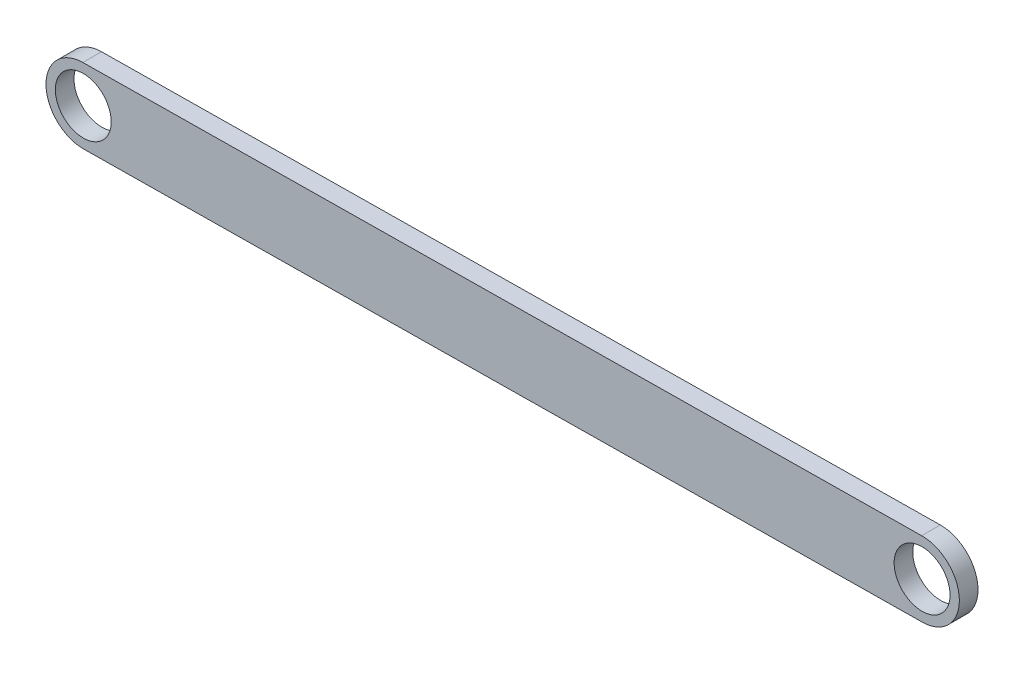
ISO-10303-21;
HEADER;
FILE_DESCRIPTION(('STEP AP214'),'2;1');
FILE_NAME('part.step','',(''),(''),'','','');
FILE_SCHEMA(('AUTOMOTIVE_DESIGN { 1 0 10303 214 1 1 1 1 }'));
ENDSEC;
DATA;
#1=APPLICATION_CONTEXT('core data for automotive mechanical design processes');
#2=APPLICATION_PROTOCOL_DEFINITION('international standard','automotive_design',2000,#1);
#3=PRODUCT_CONTEXT('',#1,'mechanical');
#4=PRODUCT('Part','Part','',(#3));
#5=PRODUCT_RELATED_PRODUCT_CATEGORY('part','',(#4));
#6=PRODUCT_DEFINITION_FORMATION('','',#4);
#7=PRODUCT_DEFINITION_CONTEXT('part definition',#1,'design');
#8=PRODUCT_DEFINITION('design','',#6,#7);
#9=PRODUCT_DEFINITION_SHAPE('','',#8);
#10=(LENGTH_UNIT() NAMED_UNIT(*) SI_UNIT(.MILLI.,.METRE.));
#11=(NAMED_UNIT(*) PLANE_ANGLE_UNIT() SI_UNIT($,.RADIAN.));
#12=(NAMED_UNIT(*) SI_UNIT($,.STERADIAN.) SOLID_ANGLE_UNIT());
#13=UNCERTAINTY_MEASURE_WITH_UNIT(LENGTH_MEASURE(1.E-05),#10,'distance_accuracy_value','');
#14=(GEOMETRIC_REPRESENTATION_CONTEXT(3) GLOBAL_UNCERTAINTY_ASSIGNED_CONTEXT((#13)) GLOBAL_UNIT_ASSIGNED_CONTEXT((#10,
#11,#12)) REPRESENTATION_CONTEXT('',''));
#15=CARTESIAN_POINT('',(0.,0.,0.));
#16=DIRECTION('',(0.,0.,1.));
#17=DIRECTION('',(1.,0.,0.));
#18=AXIS2_PLACEMENT_3D('',#15,#16,#17);
#19=CARTESIAN_POINT('',(0.,0.,10.));
#20=DIRECTION('',(0.,0.,1.));
#21=DIRECTION('',(1.,0.,0.));
#22=AXIS2_PLACEMENT_3D('',#19,#20,#21);
#23=PLANE('',#22);
#24=CARTESIAN_POINT('',(0.,0.,10.));
#25=DIRECTION('',(0.,0.,1.));
#26=DIRECTION('',(1.,0.,0.));
#27=AXIS2_PLACEMENT_3D('',#24,#25,#26);
#28=CIRCLE('',#27,15.);
#29=CARTESIAN_POINT('',(15.,0.,10.));
#30=VERTEX_POINT('',#29);
#31=EDGE_CURVE('E116',#30,#30,#28,.T.);
#32=ORIENTED_EDGE('',*,*,#31,.F.);
#33=EDGE_LOOP('',(#32));
#34=FACE_BOUND('',#33,.T.);
#35=CARTESIAN_POINT('',(0.,0.,10.));
#36=DIRECTION('',(0.,0.,1.));
#37=DIRECTION('',(1.,0.,0.));
#38=AXIS2_PLACEMENT_3D('',#35,#36,#37);
#39=CIRCLE('',#38,20.0013052022372);
#40=CARTESIAN_POINT('',(-0.228494623655914,20.,10.));
#41=VERTEX_POINT('',#40);
#42=CARTESIAN_POINT('',(0.228494623655914,-20.,10.));
#43=VERTEX_POINT('',#42);
#44=EDGE_CURVE('E96',#41,#43,#39,.T.);
#45=ORIENTED_EDGE('',*,*,#44,.T.);
#46=DIRECTION('',(0.999934744146746,0.0114239856522142,0.));
#47=VECTOR('',#46,1.);
#48=CARTESIAN_POINT('',(0.228494623655914,-20.,10.));
#49=LINE('',#48,#47);
#50=CARTESIAN_POINT('',(450.228494623656,-14.858870967742,10.));
#51=VERTEX_POINT('',#50);
#52=EDGE_CURVE('E91',#43,#51,#49,.T.);
#53=ORIENTED_EDGE('',*,*,#52,.T.);
#54=CARTESIAN_POINT('',(450.,5.14112903225806,10.));
#55=DIRECTION('',(0.,0.,1.));
#56=DIRECTION('',(1.,0.,0.));
#57=AXIS2_PLACEMENT_3D('',#54,#55,#56);
#58=CIRCLE('',#57,20.0013052022372);
#59=CARTESIAN_POINT('',(449.771505376344,25.1411290322581,10.));
#60=VERTEX_POINT('',#59);
#61=EDGE_CURVE('E94',#51,#60,#58,.T.);
#62=ORIENTED_EDGE('',*,*,#61,.T.);
#63=DIRECTION('',(-0.999934744146746,-0.0114239856522142,0.));
#64=VECTOR('',#63,1.);
#65=CARTESIAN_POINT('',(-0.228494623655914,20.,10.));
#66=LINE('',#65,#64);
#67=EDGE_CURVE('E61',#60,#41,#66,.T.);
#68=ORIENTED_EDGE('',*,*,#67,.T.);
#69=EDGE_LOOP('',(#45,#53,#62,#68));
#70=FACE_BOUND('',#69,.T.);
#71=CARTESIAN_POINT('',(450.,5.14112903225806,10.));
#72=DIRECTION('',(0.,0.,1.));
#73=DIRECTION('',(1.,0.,0.));
#74=AXIS2_PLACEMENT_3D('',#71,#72,#73);
#75=CIRCLE('',#74,15.);
#76=CARTESIAN_POINT('',(465.,5.14112903225806,10.));
#77=VERTEX_POINT('',#76);
#78=EDGE_CURVE('E138',#77,#77,#75,.T.);
#79=ORIENTED_EDGE('',*,*,#78,.F.);
#80=EDGE_LOOP('',(#79));
#81=FACE_BOUND('',#80,.T.);
#82=ADVANCED_FACE('F43',(#34,#70,#81),#23,.T.);
#83=CARTESIAN_POINT('',(0.,0.,0.));
#84=DIRECTION('',(0.,0.,1.));
#85=DIRECTION('',(1.,0.,0.));
#86=AXIS2_PLACEMENT_3D('',#83,#84,#85);
#87=PLANE('',#86);
#88=CARTESIAN_POINT('',(0.,0.,0.));
#89=DIRECTION('',(0.,0.,1.));
#90=DIRECTION('',(1.,0.,0.));
#91=AXIS2_PLACEMENT_3D('',#88,#89,#90);
#92=CIRCLE('',#91,20.0013052022372);
#93=CARTESIAN_POINT('',(-0.228494623655914,20.,0.));
#94=VERTEX_POINT('',#93);
#95=CARTESIAN_POINT('',(0.228494623655914,-20.,0.));
#96=VERTEX_POINT('',#95);
#97=EDGE_CURVE('E112',#94,#96,#92,.T.);
#98=ORIENTED_EDGE('',*,*,#97,.F.);
#99=DIRECTION('',(-0.999934744146746,-0.0114239856522142,0.));
#100=VECTOR('',#99,1.);
#101=CARTESIAN_POINT('',(-0.228494623655914,20.,0.));
#102=LINE('',#101,#100);
#103=CARTESIAN_POINT('',(449.771505376344,25.1411290322581,0.));
#104=VERTEX_POINT('',#103);
#105=EDGE_CURVE('E84',#104,#94,#102,.T.);
#106=ORIENTED_EDGE('',*,*,#105,.F.);
#107=CARTESIAN_POINT('',(450.,5.14112903225806,0.));
#108=DIRECTION('',(0.,0.,1.));
#109=DIRECTION('',(1.,0.,0.));
#110=AXIS2_PLACEMENT_3D('',#107,#108,#109);
#111=CIRCLE('',#110,20.0013052022372);
#112=CARTESIAN_POINT('',(450.228494623656,-14.858870967742,0.));
#113=VERTEX_POINT('',#112);
#114=EDGE_CURVE('E78',#113,#104,#111,.T.);
#115=ORIENTED_EDGE('',*,*,#114,.F.);
#116=DIRECTION('',(0.999934744146746,0.0114239856522142,0.));
#117=VECTOR('',#116,1.);
#118=CARTESIAN_POINT('',(0.228494623655914,-20.,0.));
#119=LINE('',#118,#117);
#120=EDGE_CURVE('E101',#96,#113,#119,.T.);
#121=ORIENTED_EDGE('',*,*,#120,.F.);
#122=EDGE_LOOP('',(#98,#106,#115,#121));
#123=FACE_BOUND('',#122,.T.);
#124=CARTESIAN_POINT('',(0.,0.,0.));
#125=DIRECTION('',(0.,0.,1.));
#126=DIRECTION('',(1.,0.,0.));
#127=AXIS2_PLACEMENT_3D('',#124,#125,#126);
#128=CIRCLE('',#127,15.);
#129=CARTESIAN_POINT('',(15.,0.,0.));
#130=VERTEX_POINT('',#129);
#131=EDGE_CURVE('E134',#130,#130,#128,.T.);
#132=ORIENTED_EDGE('',*,*,#131,.T.);
#133=EDGE_LOOP('',(#132));
#134=FACE_BOUND('',#133,.T.);
#135=CARTESIAN_POINT('',(450.,5.14112903225806,0.));
#136=DIRECTION('',(0.,0.,1.));
#137=DIRECTION('',(1.,0.,0.));
#138=AXIS2_PLACEMENT_3D('',#135,#136,#137);
#139=CIRCLE('',#138,15.);
#140=CARTESIAN_POINT('',(465.,5.14112903225806,0.));
#141=VERTEX_POINT('',#140);
#142=EDGE_CURVE('E142',#141,#141,#139,.T.);
#143=ORIENTED_EDGE('',*,*,#142,.T.);
#144=EDGE_LOOP('',(#143));
#145=FACE_BOUND('',#144,.T.);
#146=ADVANCED_FACE('F129',(#123,#134,#145),#87,.F.);
#147=CARTESIAN_POINT('',(0.,0.,10.));
#148=DIRECTION('',(0.,0.,-1.));
#149=DIRECTION('',(-1.,0.,0.));
#150=AXIS2_PLACEMENT_3D('',#147,#148,#149);
#151=CYLINDRICAL_SURFACE('',#150,20.0013052022372);
#152=ORIENTED_EDGE('',*,*,#97,.T.);
#153=DIRECTION('',(0.,0.,-1.));
#154=VECTOR('',#153,1.);
#155=CARTESIAN_POINT('',(0.228494623655914,-20.,10.));
#156=LINE('',#155,#154);
#157=EDGE_CURVE('E11',#43,#96,#156,.T.);
#158=ORIENTED_EDGE('',*,*,#157,.F.);
#159=ORIENTED_EDGE('',*,*,#44,.F.);
#160=DIRECTION('',(0.,0.,-1.));
#161=VECTOR('',#160,1.);
#162=CARTESIAN_POINT('',(-0.228494623655914,20.,10.));
#163=LINE('',#162,#161);
#164=EDGE_CURVE('E108',#41,#94,#163,.T.);
#165=ORIENTED_EDGE('',*,*,#164,.T.);
#166=EDGE_LOOP('',(#152,#158,#159,#165));
#167=FACE_BOUND('',#166,.T.);
#168=ADVANCED_FACE('F45',(#167),#151,.T.);
#169=CARTESIAN_POINT('',(0.228494623655914,-20.,10.));
#170=DIRECTION('',(-0.0114239856522142,0.999934744146746,0.));
#171=DIRECTION('',(-0.999934744146746,-0.0114239856522142,0.));
#172=AXIS2_PLACEMENT_3D('',#169,#170,#171);
#173=PLANE('',#172);
#174=ORIENTED_EDGE('',*,*,#120,.T.);
#175=DIRECTION('',(0.,0.,-1.));
#176=VECTOR('',#175,1.);
#177=CARTESIAN_POINT('',(450.228494623656,-14.858870967742,10.));
#178=LINE('',#177,#176);
#179=EDGE_CURVE('E53',#51,#113,#178,.T.);
#180=ORIENTED_EDGE('',*,*,#179,.F.);
#181=ORIENTED_EDGE('',*,*,#52,.F.);
#182=ORIENTED_EDGE('',*,*,#157,.T.);
#183=EDGE_LOOP('',(#174,#180,#181,#182));
#184=FACE_BOUND('',#183,.T.);
#185=ADVANCED_FACE('F100',(#184),#173,.F.);
#186=CARTESIAN_POINT('',(450.,5.14112903225806,10.));
#187=DIRECTION('',(0.,0.,-1.));
#188=DIRECTION('',(-1.,0.,0.));
#189=AXIS2_PLACEMENT_3D('',#186,#187,#188);
#190=CYLINDRICAL_SURFACE('',#189,20.0013052022372);
#191=ORIENTED_EDGE('',*,*,#114,.T.);
#192=DIRECTION('',(0.,0.,-1.));
#193=VECTOR('',#192,1.);
#194=CARTESIAN_POINT('',(449.771505376344,25.1411290322581,10.));
#195=LINE('',#194,#193);
#196=EDGE_CURVE('E103',#60,#104,#195,.T.);
#197=ORIENTED_EDGE('',*,*,#196,.F.);
#198=ORIENTED_EDGE('',*,*,#61,.F.);
#199=ORIENTED_EDGE('',*,*,#179,.T.);
#200=EDGE_LOOP('',(#191,#197,#198,#199));
#201=FACE_BOUND('',#200,.T.);
#202=ADVANCED_FACE('F104',(#201),#190,.T.);
#203=CARTESIAN_POINT('',(-0.228494623655914,20.,10.));
#204=DIRECTION('',(0.0114239856522142,-0.999934744146746,0.));
#205=DIRECTION('',(0.999934744146746,0.0114239856522142,0.));
#206=AXIS2_PLACEMENT_3D('',#203,#204,#205);
#207=PLANE('',#206);
#208=ORIENTED_EDGE('',*,*,#105,.T.);
#209=ORIENTED_EDGE('',*,*,#164,.F.);
#210=ORIENTED_EDGE('',*,*,#67,.F.);
#211=ORIENTED_EDGE('',*,*,#196,.T.);
#212=EDGE_LOOP('',(#208,#209,#210,#211));
#213=FACE_BOUND('',#212,.T.);
#214=ADVANCED_FACE('F126',(#213),#207,.F.);
#215=CARTESIAN_POINT('',(0.,0.,10.));
#216=DIRECTION('',(0.,0.,-1.));
#217=DIRECTION('',(-1.,0.,0.));
#218=AXIS2_PLACEMENT_3D('',#215,#216,#217);
#219=CYLINDRICAL_SURFACE('',#218,15.);
#220=ORIENTED_EDGE('',*,*,#31,.T.);
#221=EDGE_LOOP('',(#220));
#222=FACE_BOUND('',#221,.T.);
#223=ORIENTED_EDGE('',*,*,#131,.F.);
#224=EDGE_LOOP('',(#223));
#225=FACE_BOUND('',#224,.T.);
#226=ADVANCED_FACE('F161',(#222,#225),#219,.F.);
#227=CARTESIAN_POINT('',(450.,5.14112903225806,10.));
#228=DIRECTION('',(0.,0.,-1.));
#229=DIRECTION('',(-1.,0.,0.));
#230=AXIS2_PLACEMENT_3D('',#227,#228,#229);
#231=CYLINDRICAL_SURFACE('',#230,15.);
#232=ORIENTED_EDGE('',*,*,#78,.T.);
#233=EDGE_LOOP('',(#232));
#234=FACE_BOUND('',#233,.T.);
#235=ORIENTED_EDGE('',*,*,#142,.F.);
#236=EDGE_LOOP('',(#235));
#237=FACE_BOUND('',#236,.T.);
#238=ADVANCED_FACE('F150',(#234,#237),#231,.F.);
#239=CLOSED_SHELL('',(#82,#146,#168,#185,#202,#214,#226,#238));
#240=MANIFOLD_SOLID_BREP('B2',#239);
#241=ADVANCED_BREP_SHAPE_REPRESENTATION('',(#18,#240),#14);
#242=SHAPE_DEFINITION_REPRESENTATION(#9,#241);
ENDSEC;
END-ISO-10303-21;
